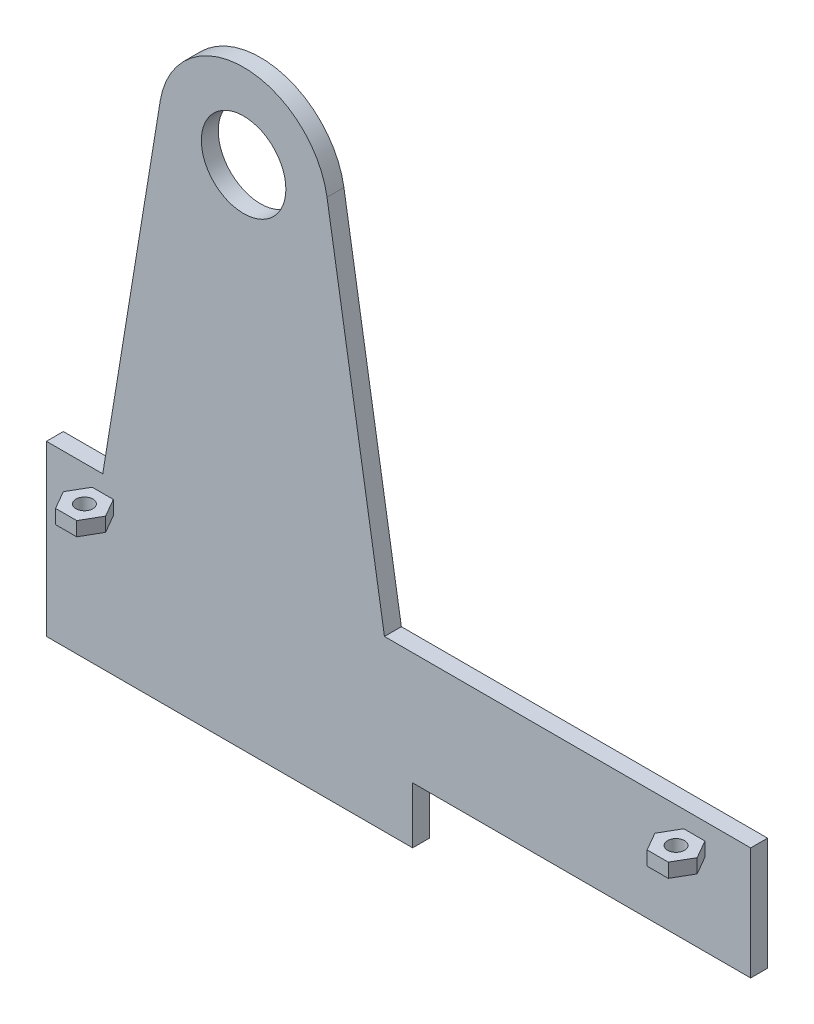
ISO-10303-21;
HEADER;
FILE_DESCRIPTION(('STEP AP214'),'2;1');
FILE_NAME('part.step','',(''),(''),'','','');
FILE_SCHEMA(('AUTOMOTIVE_DESIGN { 1 0 10303 214 1 1 1 1 }'));
ENDSEC;
DATA;
#1=APPLICATION_CONTEXT('core data for automotive mechanical design processes');
#2=APPLICATION_PROTOCOL_DEFINITION('international standard','automotive_design',2000,#1);
#3=PRODUCT_CONTEXT('',#1,'mechanical');
#4=PRODUCT('Part','Part','',(#3));
#5=PRODUCT_RELATED_PRODUCT_CATEGORY('part','',(#4));
#6=PRODUCT_DEFINITION_FORMATION('','',#4);
#7=PRODUCT_DEFINITION_CONTEXT('part definition',#1,'design');
#8=PRODUCT_DEFINITION('design','',#6,#7);
#9=PRODUCT_DEFINITION_SHAPE('','',#8);
#10=(LENGTH_UNIT() NAMED_UNIT(*) SI_UNIT(.MILLI.,.METRE.));
#11=(NAMED_UNIT(*) PLANE_ANGLE_UNIT() SI_UNIT($,.RADIAN.));
#12=(NAMED_UNIT(*) SI_UNIT($,.STERADIAN.) SOLID_ANGLE_UNIT());
#13=UNCERTAINTY_MEASURE_WITH_UNIT(LENGTH_MEASURE(1.E-05),#10,'distance_accuracy_value','');
#14=(GEOMETRIC_REPRESENTATION_CONTEXT(3) GLOBAL_UNCERTAINTY_ASSIGNED_CONTEXT((#13)) GLOBAL_UNIT_ASSIGNED_CONTEXT((#10,
#11,#12)) REPRESENTATION_CONTEXT('',''));
#15=CARTESIAN_POINT('',(0.,0.,0.));
#16=DIRECTION('',(0.,0.,1.));
#17=DIRECTION('',(1.,0.,0.));
#18=AXIS2_PLACEMENT_3D('',#15,#16,#17);
#19=CARTESIAN_POINT('',(-41.2472232502675,49.,19.));
#20=DIRECTION('',(0.866025403784439,0.,0.5));
#21=DIRECTION('',(0.5,0.,-0.866025403784439));
#22=AXIS2_PLACEMENT_3D('',#19,#20,#21);
#23=PLANE('',#22);
#24=DIRECTION('',(0.5,0.,-0.866025403784439));
#25=VECTOR('',#24,1.);
#26=CARTESIAN_POINT('',(-41.2472232502675,54.,19.));
#27=LINE('',#26,#25);
#28=CARTESIAN_POINT('',(-41.2472232502675,54.,19.));
#29=VERTEX_POINT('',#28);
#30=CARTESIAN_POINT('',(-37.4944465005349,54.,12.5));
#31=VERTEX_POINT('',#30);
#32=EDGE_CURVE('E140',#29,#31,#27,.T.);
#33=ORIENTED_EDGE('',*,*,#32,.F.);
#34=DIRECTION('',(0.,1.,0.));
#35=VECTOR('',#34,1.);
#36=CARTESIAN_POINT('',(-41.2472232502675,49.,19.));
#37=LINE('',#36,#35);
#38=CARTESIAN_POINT('',(-41.2472232502675,49.,19.));
#39=VERTEX_POINT('',#38);
#40=EDGE_CURVE('E12',#39,#29,#37,.T.);
#41=ORIENTED_EDGE('',*,*,#40,.F.);
#42=DIRECTION('',(0.5,0.,-0.866025403784439));
#43=VECTOR('',#42,1.);
#44=CARTESIAN_POINT('',(-41.2472232502675,49.,19.));
#45=LINE('',#44,#43);
#46=CARTESIAN_POINT('',(-37.4944465005349,49.,12.5));
#47=VERTEX_POINT('',#46);
#48=EDGE_CURVE('E150',#39,#47,#45,.T.);
#49=ORIENTED_EDGE('',*,*,#48,.T.);
#50=DIRECTION('',(0.,1.,0.));
#51=VECTOR('',#50,1.);
#52=CARTESIAN_POINT('',(-37.4944465005349,49.,12.5));
#53=LINE('',#52,#51);
#54=EDGE_CURVE('E51',#47,#31,#53,.T.);
#55=ORIENTED_EDGE('',*,*,#54,.T.);
#56=EDGE_LOOP('',(#33,#41,#49,#55));
#57=FACE_BOUND('',#56,.T.);
#58=ADVANCED_FACE('F48',(#57),#23,.T.);
#59=CARTESIAN_POINT('',(-48.7527767497326,49.,19.));
#60=DIRECTION('',(0.,0.,1.));
#61=DIRECTION('',(1.,0.,0.));
#62=AXIS2_PLACEMENT_3D('',#59,#60,#61);
#63=PLANE('',#62);
#64=DIRECTION('',(1.,0.,0.));
#65=VECTOR('',#64,1.);
#66=CARTESIAN_POINT('',(-48.7527767497326,54.,19.));
#67=LINE('',#66,#65);
#68=CARTESIAN_POINT('',(-48.7527767497326,54.,19.));
#69=VERTEX_POINT('',#68);
#70=EDGE_CURVE('E93',#69,#29,#67,.T.);
#71=ORIENTED_EDGE('',*,*,#70,.F.);
#72=DIRECTION('',(0.,1.,0.));
#73=VECTOR('',#72,1.);
#74=CARTESIAN_POINT('',(-48.7527767497326,49.,19.));
#75=LINE('',#74,#73);
#76=CARTESIAN_POINT('',(-48.7527767497326,49.,19.));
#77=VERTEX_POINT('',#76);
#78=EDGE_CURVE('E57',#77,#69,#75,.T.);
#79=ORIENTED_EDGE('',*,*,#78,.F.);
#80=DIRECTION('',(1.,0.,0.));
#81=VECTOR('',#80,1.);
#82=CARTESIAN_POINT('',(-48.7527767497326,49.,19.));
#83=LINE('',#82,#81);
#84=EDGE_CURVE('E65',#77,#39,#83,.T.);
#85=ORIENTED_EDGE('',*,*,#84,.T.);
#86=ORIENTED_EDGE('',*,*,#40,.T.);
#87=EDGE_LOOP('',(#71,#79,#85,#86));
#88=FACE_BOUND('',#87,.T.);
#89=ADVANCED_FACE('F171',(#88),#63,.T.);
#90=CARTESIAN_POINT('',(-52.5055534994651,49.,12.5));
#91=DIRECTION('',(-0.866025403784438,0.,0.5));
#92=DIRECTION('',(0.5,0.,0.866025403784439));
#93=AXIS2_PLACEMENT_3D('',#90,#91,#92);
#94=PLANE('',#93);
#95=DIRECTION('',(0.5,0.,0.866025403784438));
#96=VECTOR('',#95,1.);
#97=CARTESIAN_POINT('',(-52.5055534994651,54.,12.5));
#98=LINE('',#97,#96);
#99=CARTESIAN_POINT('',(-52.5055534994651,54.,12.5));
#100=VERTEX_POINT('',#99);
#101=EDGE_CURVE('E88',#100,#69,#98,.T.);
#102=ORIENTED_EDGE('',*,*,#101,.F.);
#103=DIRECTION('',(0.,1.,0.));
#104=VECTOR('',#103,1.);
#105=CARTESIAN_POINT('',(-52.5055534994651,49.,12.5));
#106=LINE('',#105,#104);
#107=CARTESIAN_POINT('',(-52.5055534994651,49.,12.5));
#108=VERTEX_POINT('',#107);
#109=EDGE_CURVE('E116',#108,#100,#106,.T.);
#110=ORIENTED_EDGE('',*,*,#109,.F.);
#111=DIRECTION('',(0.5,0.,0.866025403784438));
#112=VECTOR('',#111,1.);
#113=CARTESIAN_POINT('',(-52.5055534994651,49.,12.5));
#114=LINE('',#113,#112);
#115=EDGE_CURVE('E119',#108,#77,#114,.T.);
#116=ORIENTED_EDGE('',*,*,#115,.T.);
#117=ORIENTED_EDGE('',*,*,#78,.T.);
#118=EDGE_LOOP('',(#102,#110,#116,#117));
#119=FACE_BOUND('',#118,.T.);
#120=ADVANCED_FACE('F125',(#119),#94,.T.);
#121=CARTESIAN_POINT('',(-48.7527767497326,49.,6.));
#122=DIRECTION('',(-0.866025403784439,0.,-0.5));
#123=DIRECTION('',(-0.5,0.,0.866025403784439));
#124=AXIS2_PLACEMENT_3D('',#121,#122,#123);
#125=PLANE('',#124);
#126=DIRECTION('',(-0.5,0.,0.866025403784439));
#127=VECTOR('',#126,1.);
#128=CARTESIAN_POINT('',(-48.7527767497326,54.,6.));
#129=LINE('',#128,#127);
#130=CARTESIAN_POINT('',(-48.7527767497326,54.,6.));
#131=VERTEX_POINT('',#130);
#132=EDGE_CURVE('E147',#131,#100,#129,.T.);
#133=ORIENTED_EDGE('',*,*,#132,.F.);
#134=DIRECTION('',(0.,1.,0.));
#135=VECTOR('',#134,1.);
#136=CARTESIAN_POINT('',(-48.7527767497326,49.,6.));
#137=LINE('',#136,#135);
#138=CARTESIAN_POINT('',(-48.7527767497326,49.,6.));
#139=VERTEX_POINT('',#138);
#140=EDGE_CURVE('E118',#139,#131,#137,.T.);
#141=ORIENTED_EDGE('',*,*,#140,.F.);
#142=DIRECTION('',(-0.5,0.,0.866025403784439));
#143=VECTOR('',#142,1.);
#144=CARTESIAN_POINT('',(-48.7527767497326,49.,6.));
#145=LINE('',#144,#143);
#146=EDGE_CURVE('E111',#139,#108,#145,.T.);
#147=ORIENTED_EDGE('',*,*,#146,.T.);
#148=ORIENTED_EDGE('',*,*,#109,.T.);
#149=EDGE_LOOP('',(#133,#141,#147,#148));
#150=FACE_BOUND('',#149,.T.);
#151=ADVANCED_FACE('F114',(#150),#125,.T.);
#152=CARTESIAN_POINT('',(-41.2472232502674,49.,6.));
#153=DIRECTION('',(0.,0.,-1.));
#154=DIRECTION('',(-1.,0.,0.));
#155=AXIS2_PLACEMENT_3D('',#152,#153,#154);
#156=PLANE('',#155);
#157=DIRECTION('',(-1.,0.,0.));
#158=VECTOR('',#157,1.);
#159=CARTESIAN_POINT('',(-41.2472232502674,54.,6.));
#160=LINE('',#159,#158);
#161=CARTESIAN_POINT('',(-41.2472232502674,54.,6.));
#162=VERTEX_POINT('',#161);
#163=EDGE_CURVE('E145',#162,#131,#160,.T.);
#164=ORIENTED_EDGE('',*,*,#163,.F.);
#165=DIRECTION('',(0.,1.,0.));
#166=VECTOR('',#165,1.);
#167=CARTESIAN_POINT('',(-41.2472232502674,49.,6.));
#168=LINE('',#167,#166);
#169=CARTESIAN_POINT('',(-41.2472232502674,49.,6.));
#170=VERTEX_POINT('',#169);
#171=EDGE_CURVE('E128',#170,#162,#168,.T.);
#172=ORIENTED_EDGE('',*,*,#171,.F.);
#173=DIRECTION('',(-1.,0.,0.));
#174=VECTOR('',#173,1.);
#175=CARTESIAN_POINT('',(-41.2472232502674,49.,6.));
#176=LINE('',#175,#174);
#177=EDGE_CURVE('E120',#170,#139,#176,.T.);
#178=ORIENTED_EDGE('',*,*,#177,.T.);
#179=ORIENTED_EDGE('',*,*,#140,.T.);
#180=EDGE_LOOP('',(#164,#172,#178,#179));
#181=FACE_BOUND('',#180,.T.);
#182=ADVANCED_FACE('F159',(#181),#156,.T.);
#183=CARTESIAN_POINT('',(-37.4944465005349,49.,12.5));
#184=DIRECTION('',(0.86602540378444,0.,-0.499999999999997));
#185=DIRECTION('',(-0.499999999999997,0.,-0.86602540378444));
#186=AXIS2_PLACEMENT_3D('',#183,#184,#185);
#187=PLANE('',#186);
#188=DIRECTION('',(-0.499999999999997,0.,-0.86602540378444));
#189=VECTOR('',#188,1.);
#190=CARTESIAN_POINT('',(-37.4944465005349,54.,12.5));
#191=LINE('',#190,#189);
#192=EDGE_CURVE('E142',#31,#162,#191,.T.);
#193=ORIENTED_EDGE('',*,*,#192,.F.);
#194=ORIENTED_EDGE('',*,*,#54,.F.);
#195=DIRECTION('',(-0.499999999999997,0.,-0.86602540378444));
#196=VECTOR('',#195,1.);
#197=CARTESIAN_POINT('',(-37.4944465005349,49.,12.5));
#198=LINE('',#197,#196);
#199=EDGE_CURVE('E100',#47,#170,#198,.T.);
#200=ORIENTED_EDGE('',*,*,#199,.T.);
#201=ORIENTED_EDGE('',*,*,#171,.T.);
#202=EDGE_LOOP('',(#193,#194,#200,#201));
#203=FACE_BOUND('',#202,.T.);
#204=ADVANCED_FACE('F161',(#203),#187,.T.);
#205=CARTESIAN_POINT('',(120.,49.,0.));
#206=DIRECTION('',(0.,1.,0.));
#207=DIRECTION('',(0.,0.,-1.));
#208=AXIS2_PLACEMENT_3D('',#205,#206,#207);
#209=PLANE('',#208);
#210=CARTESIAN_POINT('',(-45.,49.,12.5));
#211=DIRECTION('',(0.,1.,0.));
#212=DIRECTION('',(0.,0.,-1.));
#213=AXIS2_PLACEMENT_3D('',#210,#211,#212);
#214=CIRCLE('',#213,2.99999999999999);
#215=CARTESIAN_POINT('',(-45.,49.,9.50000000000003));
#216=VERTEX_POINT('',#215);
#217=EDGE_CURVE('E143',#216,#216,#214,.T.);
#218=ORIENTED_EDGE('',*,*,#217,.T.);
#219=EDGE_LOOP('',(#218));
#220=FACE_BOUND('',#219,.T.);
#221=ORIENTED_EDGE('',*,*,#48,.F.);
#222=ORIENTED_EDGE('',*,*,#84,.F.);
#223=ORIENTED_EDGE('',*,*,#115,.F.);
#224=ORIENTED_EDGE('',*,*,#146,.F.);
#225=ORIENTED_EDGE('',*,*,#177,.F.);
#226=ORIENTED_EDGE('',*,*,#199,.F.);
#227=EDGE_LOOP('',(#221,#222,#223,#224,#225,#226));
#228=FACE_BOUND('',#227,.T.);
#229=ADVANCED_FACE('F122',(#220,#228),#209,.F.);
#230=CARTESIAN_POINT('',(120.,54.,0.));
#231=DIRECTION('',(0.,1.,0.));
#232=DIRECTION('',(0.,0.,-1.));
#233=AXIS2_PLACEMENT_3D('',#230,#231,#232);
#234=PLANE('',#233);
#235=CARTESIAN_POINT('',(-45.,54.,12.5));
#236=DIRECTION('',(0.,1.,0.));
#237=DIRECTION('',(0.,0.,-1.));
#238=AXIS2_PLACEMENT_3D('',#235,#236,#237);
#239=CIRCLE('',#238,2.99999999999999);
#240=CARTESIAN_POINT('',(-45.,54.,9.50000000000003));
#241=VERTEX_POINT('',#240);
#242=EDGE_CURVE('E155',#241,#241,#239,.T.);
#243=ORIENTED_EDGE('',*,*,#242,.F.);
#244=EDGE_LOOP('',(#243));
#245=FACE_BOUND('',#244,.T.);
#246=ORIENTED_EDGE('',*,*,#32,.T.);
#247=ORIENTED_EDGE('',*,*,#192,.T.);
#248=ORIENTED_EDGE('',*,*,#163,.T.);
#249=ORIENTED_EDGE('',*,*,#132,.T.);
#250=ORIENTED_EDGE('',*,*,#101,.T.);
#251=ORIENTED_EDGE('',*,*,#70,.T.);
#252=EDGE_LOOP('',(#246,#247,#248,#249,#250,#251));
#253=FACE_BOUND('',#252,.T.);
#254=ADVANCED_FACE('F160',(#245,#253),#234,.T.);
#255=CARTESIAN_POINT('',(-45.,49.,12.5));
#256=DIRECTION('',(0.,1.,0.));
#257=DIRECTION('',(0.,0.,-1.));
#258=AXIS2_PLACEMENT_3D('',#255,#256,#257);
#259=CYLINDRICAL_SURFACE('',#258,2.99999999999999);
#260=ORIENTED_EDGE('',*,*,#217,.F.);
#261=EDGE_LOOP('',(#260));
#262=FACE_BOUND('',#261,.T.);
#263=ORIENTED_EDGE('',*,*,#242,.T.);
#264=EDGE_LOOP('',(#263));
#265=FACE_BOUND('',#264,.T.);
#266=ADVANCED_FACE('F210',(#262,#265),#259,.F.);
#267=CLOSED_SHELL('',(#58,#89,#120,#151,#182,#204,#229,#254,#266));
#268=MANIFOLD_SOLID_BREP('B2',#267);
#269=CARTESIAN_POINT('',(161.247223250267,49.,19.));
#270=DIRECTION('',(-0.866025403784439,0.,0.5));
#271=DIRECTION('',(-0.5,0.,-0.866025403784439));
#272=AXIS2_PLACEMENT_3D('',#269,#270,#271);
#273=PLANE('',#272);
#274=DIRECTION('',(-0.5,0.,-0.866025403784439));
#275=VECTOR('',#274,1.);
#276=CARTESIAN_POINT('',(161.247223250267,54.,19.));
#277=LINE('',#276,#275);
#278=CARTESIAN_POINT('',(161.247223250267,54.,19.));
#279=VERTEX_POINT('',#278);
#280=CARTESIAN_POINT('',(157.494446500535,54.,12.5));
#281=VERTEX_POINT('',#280);
#282=EDGE_CURVE('E338',#279,#281,#277,.T.);
#283=ORIENTED_EDGE('',*,*,#282,.T.);
#284=DIRECTION('',(0.,1.,0.));
#285=VECTOR('',#284,1.);
#286=CARTESIAN_POINT('',(157.494446500535,49.,12.5));
#287=LINE('',#286,#285);
#288=CARTESIAN_POINT('',(157.494446500535,49.,12.5));
#289=VERTEX_POINT('',#288);
#290=EDGE_CURVE('E257',#289,#281,#287,.T.);
#291=ORIENTED_EDGE('',*,*,#290,.F.);
#292=DIRECTION('',(-0.5,0.,-0.866025403784439));
#293=VECTOR('',#292,1.);
#294=CARTESIAN_POINT('',(161.247223250267,49.,19.));
#295=LINE('',#294,#293);
#296=CARTESIAN_POINT('',(161.247223250267,49.,19.));
#297=VERTEX_POINT('',#296);
#298=EDGE_CURVE('E348',#297,#289,#295,.T.);
#299=ORIENTED_EDGE('',*,*,#298,.F.);
#300=DIRECTION('',(0.,1.,0.));
#301=VECTOR('',#300,1.);
#302=CARTESIAN_POINT('',(161.247223250267,49.,19.));
#303=LINE('',#302,#301);
#304=EDGE_CURVE('E46',#297,#279,#303,.T.);
#305=ORIENTED_EDGE('',*,*,#304,.T.);
#306=EDGE_LOOP('',(#283,#291,#299,#305));
#307=FACE_BOUND('',#306,.T.);
#308=ADVANCED_FACE('F254',(#307),#273,.T.);
#309=CARTESIAN_POINT('',(168.752776749733,49.,19.));
#310=DIRECTION('',(0.,0.,1.));
#311=DIRECTION('',(-1.,0.,0.));
#312=AXIS2_PLACEMENT_3D('',#309,#310,#311);
#313=PLANE('',#312);
#314=DIRECTION('',(-1.,0.,0.));
#315=VECTOR('',#314,1.);
#316=CARTESIAN_POINT('',(168.752776749733,54.,19.));
#317=LINE('',#316,#315);
#318=CARTESIAN_POINT('',(168.752776749733,54.,19.));
#319=VERTEX_POINT('',#318);
#320=EDGE_CURVE('E301',#319,#279,#317,.T.);
#321=ORIENTED_EDGE('',*,*,#320,.T.);
#322=ORIENTED_EDGE('',*,*,#304,.F.);
#323=DIRECTION('',(-1.,0.,0.));
#324=VECTOR('',#323,1.);
#325=CARTESIAN_POINT('',(168.752776749733,49.,19.));
#326=LINE('',#325,#324);
#327=CARTESIAN_POINT('',(168.752776749733,49.,19.));
#328=VERTEX_POINT('',#327);
#329=EDGE_CURVE('E272',#328,#297,#326,.T.);
#330=ORIENTED_EDGE('',*,*,#329,.F.);
#331=DIRECTION('',(0.,1.,0.));
#332=VECTOR('',#331,1.);
#333=CARTESIAN_POINT('',(168.752776749733,49.,19.));
#334=LINE('',#333,#332);
#335=EDGE_CURVE('E263',#328,#319,#334,.T.);
#336=ORIENTED_EDGE('',*,*,#335,.T.);
#337=EDGE_LOOP('',(#321,#322,#330,#336));
#338=FACE_BOUND('',#337,.T.);
#339=ADVANCED_FACE('F385',(#338),#313,.T.);
#340=CARTESIAN_POINT('',(172.505553499465,49.,12.5));
#341=DIRECTION('',(0.866025403784438,0.,0.5));
#342=DIRECTION('',(-0.5,0.,0.866025403784439));
#343=AXIS2_PLACEMENT_3D('',#340,#341,#342);
#344=PLANE('',#343);
#345=DIRECTION('',(-0.5,0.,0.866025403784438));
#346=VECTOR('',#345,1.);
#347=CARTESIAN_POINT('',(172.505553499465,54.,12.5));
#348=LINE('',#347,#346);
#349=CARTESIAN_POINT('',(172.505553499465,54.,12.5));
#350=VERTEX_POINT('',#349);
#351=EDGE_CURVE('E295',#350,#319,#348,.T.);
#352=ORIENTED_EDGE('',*,*,#351,.T.);
#353=ORIENTED_EDGE('',*,*,#335,.F.);
#354=DIRECTION('',(-0.5,0.,0.866025403784438));
#355=VECTOR('',#354,1.);
#356=CARTESIAN_POINT('',(172.505553499465,49.,12.5));
#357=LINE('',#356,#355);
#358=CARTESIAN_POINT('',(172.505553499465,49.,12.5));
#359=VERTEX_POINT('',#358);
#360=EDGE_CURVE('E320',#359,#328,#357,.T.);
#361=ORIENTED_EDGE('',*,*,#360,.F.);
#362=DIRECTION('',(0.,1.,0.));
#363=VECTOR('',#362,1.);
#364=CARTESIAN_POINT('',(172.505553499465,49.,12.5));
#365=LINE('',#364,#363);
#366=EDGE_CURVE('E327',#359,#350,#365,.T.);
#367=ORIENTED_EDGE('',*,*,#366,.T.);
#368=EDGE_LOOP('',(#352,#353,#361,#367));
#369=FACE_BOUND('',#368,.T.);
#370=ADVANCED_FACE('F333',(#369),#344,.T.);
#371=CARTESIAN_POINT('',(168.752776749733,49.,6.));
#372=DIRECTION('',(0.866025403784439,0.,-0.5));
#373=DIRECTION('',(0.5,0.,0.866025403784439));
#374=AXIS2_PLACEMENT_3D('',#371,#372,#373);
#375=PLANE('',#374);
#376=DIRECTION('',(0.5,0.,0.866025403784439));
#377=VECTOR('',#376,1.);
#378=CARTESIAN_POINT('',(168.752776749733,54.,6.));
#379=LINE('',#378,#377);
#380=CARTESIAN_POINT('',(168.752776749733,54.,6.));
#381=VERTEX_POINT('',#380);
#382=EDGE_CURVE('E330',#381,#350,#379,.T.);
#383=ORIENTED_EDGE('',*,*,#382,.T.);
#384=ORIENTED_EDGE('',*,*,#366,.F.);
#385=DIRECTION('',(0.5,0.,0.866025403784439));
#386=VECTOR('',#385,1.);
#387=CARTESIAN_POINT('',(168.752776749733,49.,6.));
#388=LINE('',#387,#386);
#389=CARTESIAN_POINT('',(168.752776749733,49.,6.));
#390=VERTEX_POINT('',#389);
#391=EDGE_CURVE('E316',#390,#359,#388,.T.);
#392=ORIENTED_EDGE('',*,*,#391,.F.);
#393=DIRECTION('',(0.,1.,0.));
#394=VECTOR('',#393,1.);
#395=CARTESIAN_POINT('',(168.752776749733,49.,6.));
#396=LINE('',#395,#394);
#397=EDGE_CURVE('E331',#390,#381,#396,.T.);
#398=ORIENTED_EDGE('',*,*,#397,.T.);
#399=EDGE_LOOP('',(#383,#384,#392,#398));
#400=FACE_BOUND('',#399,.T.);
#401=ADVANCED_FACE('F328',(#400),#375,.T.);
#402=CARTESIAN_POINT('',(161.247223250267,49.,6.));
#403=DIRECTION('',(0.,0.,-1.));
#404=DIRECTION('',(1.,0.,0.));
#405=AXIS2_PLACEMENT_3D('',#402,#403,#404);
#406=PLANE('',#405);
#407=DIRECTION('',(1.,0.,0.));
#408=VECTOR('',#407,1.);
#409=CARTESIAN_POINT('',(161.247223250267,54.,6.));
#410=LINE('',#409,#408);
#411=CARTESIAN_POINT('',(161.247223250267,54.,6.));
#412=VERTEX_POINT('',#411);
#413=EDGE_CURVE('E344',#412,#381,#410,.T.);
#414=ORIENTED_EDGE('',*,*,#413,.T.);
#415=ORIENTED_EDGE('',*,*,#397,.F.);
#416=DIRECTION('',(1.,0.,0.));
#417=VECTOR('',#416,1.);
#418=CARTESIAN_POINT('',(161.247223250267,49.,6.));
#419=LINE('',#418,#417);
#420=CARTESIAN_POINT('',(161.247223250267,49.,6.));
#421=VERTEX_POINT('',#420);
#422=EDGE_CURVE('E322',#421,#390,#419,.T.);
#423=ORIENTED_EDGE('',*,*,#422,.F.);
#424=DIRECTION('',(0.,1.,0.));
#425=VECTOR('',#424,1.);
#426=CARTESIAN_POINT('',(161.247223250267,49.,6.));
#427=LINE('',#426,#425);
#428=EDGE_CURVE('E351',#421,#412,#427,.T.);
#429=ORIENTED_EDGE('',*,*,#428,.T.);
#430=EDGE_LOOP('',(#414,#415,#423,#429));
#431=FACE_BOUND('',#430,.T.);
#432=ADVANCED_FACE('F362',(#431),#406,.T.);
#433=CARTESIAN_POINT('',(157.494446500535,49.,12.5));
#434=DIRECTION('',(-0.86602540378444,0.,-0.499999999999997));
#435=DIRECTION('',(0.499999999999997,0.,-0.86602540378444));
#436=AXIS2_PLACEMENT_3D('',#433,#434,#435);
#437=PLANE('',#436);
#438=DIRECTION('',(0.499999999999997,0.,-0.86602540378444));
#439=VECTOR('',#438,1.);
#440=CARTESIAN_POINT('',(157.494446500535,54.,12.5));
#441=LINE('',#440,#439);
#442=EDGE_CURVE('E341',#281,#412,#441,.T.);
#443=ORIENTED_EDGE('',*,*,#442,.T.);
#444=ORIENTED_EDGE('',*,*,#428,.F.);
#445=DIRECTION('',(0.499999999999997,0.,-0.86602540378444));
#446=VECTOR('',#445,1.);
#447=CARTESIAN_POINT('',(157.494446500535,49.,12.5));
#448=LINE('',#447,#446);
#449=EDGE_CURVE('E309',#289,#421,#448,.T.);
#450=ORIENTED_EDGE('',*,*,#449,.F.);
#451=ORIENTED_EDGE('',*,*,#290,.T.);
#452=EDGE_LOOP('',(#443,#444,#450,#451));
#453=FACE_BOUND('',#452,.T.);
#454=ADVANCED_FACE('F356',(#453),#437,.T.);
#455=CARTESIAN_POINT('',(0.,49.,0.));
#456=DIRECTION('',(0.,1.,0.));
#457=DIRECTION('',(0.,0.,-1.));
#458=AXIS2_PLACEMENT_3D('',#455,#456,#457);
#459=PLANE('',#458);
#460=CARTESIAN_POINT('',(165.,49.,12.5));
#461=DIRECTION('',(0.,-1.,0.));
#462=DIRECTION('',(0.,0.,-1.));
#463=AXIS2_PLACEMENT_3D('',#460,#461,#462);
#464=CIRCLE('',#463,2.99999999999999);
#465=CARTESIAN_POINT('',(165.,49.,9.50000000000003));
#466=VERTEX_POINT('',#465);
#467=EDGE_CURVE('E342',#466,#466,#464,.T.);
#468=ORIENTED_EDGE('',*,*,#467,.F.);
#469=EDGE_LOOP('',(#468));
#470=FACE_BOUND('',#469,.T.);
#471=ORIENTED_EDGE('',*,*,#298,.T.);
#472=ORIENTED_EDGE('',*,*,#449,.T.);
#473=ORIENTED_EDGE('',*,*,#422,.T.);
#474=ORIENTED_EDGE('',*,*,#391,.T.);
#475=ORIENTED_EDGE('',*,*,#360,.T.);
#476=ORIENTED_EDGE('',*,*,#329,.T.);
#477=EDGE_LOOP('',(#471,#472,#473,#474,#475,#476));
#478=FACE_BOUND('',#477,.T.);
#479=ADVANCED_FACE('F318',(#470,#478),#459,.F.);
#480=CARTESIAN_POINT('',(0.,54.,0.));
#481=DIRECTION('',(0.,1.,0.));
#482=DIRECTION('',(0.,0.,-1.));
#483=AXIS2_PLACEMENT_3D('',#480,#481,#482);
#484=PLANE('',#483);
#485=CARTESIAN_POINT('',(165.,54.,12.5));
#486=DIRECTION('',(0.,-1.,0.));
#487=DIRECTION('',(0.,0.,-1.));
#488=AXIS2_PLACEMENT_3D('',#485,#486,#487);
#489=CIRCLE('',#488,2.99999999999999);
#490=CARTESIAN_POINT('',(165.,54.,9.50000000000003));
#491=VERTEX_POINT('',#490);
#492=EDGE_CURVE('E366',#491,#491,#489,.T.);
#493=ORIENTED_EDGE('',*,*,#492,.T.);
#494=EDGE_LOOP('',(#493));
#495=FACE_BOUND('',#494,.T.);
#496=ORIENTED_EDGE('',*,*,#282,.F.);
#497=ORIENTED_EDGE('',*,*,#320,.F.);
#498=ORIENTED_EDGE('',*,*,#351,.F.);
#499=ORIENTED_EDGE('',*,*,#382,.F.);
#500=ORIENTED_EDGE('',*,*,#413,.F.);
#501=ORIENTED_EDGE('',*,*,#442,.F.);
#502=EDGE_LOOP('',(#496,#497,#498,#499,#500,#501));
#503=FACE_BOUND('',#502,.T.);
#504=ADVANCED_FACE('F361',(#495,#503),#484,.T.);
#505=CARTESIAN_POINT('',(165.,49.,12.5));
#506=DIRECTION('',(0.,1.,0.));
#507=DIRECTION('',(0.,0.,-1.));
#508=AXIS2_PLACEMENT_3D('',#505,#506,#507);
#509=CYLINDRICAL_SURFACE('',#508,2.99999999999999);
#510=ORIENTED_EDGE('',*,*,#467,.T.);
#511=EDGE_LOOP('',(#510));
#512=FACE_BOUND('',#511,.T.);
#513=ORIENTED_EDGE('',*,*,#492,.F.);
#514=EDGE_LOOP('',(#513));
#515=FACE_BOUND('',#514,.T.);
#516=ADVANCED_FACE('F372',(#512,#515),#509,.F.);
#517=CLOSED_SHELL('',(#308,#339,#370,#401,#432,#454,#479,#504,#516));
#518=MANIFOLD_SOLID_BREP('B6',#517);
#519=CARTESIAN_POINT('',(-65.,60.,6.));
#520=DIRECTION('',(0.,1.,0.));
#521=DIRECTION('',(0.,0.,-1.));
#522=AXIS2_PLACEMENT_3D('',#519,#520,#521);
#523=PLANE('',#522);
#524=DIRECTION('',(-1.,0.,0.));
#525=VECTOR('',#524,1.);
#526=CARTESIAN_POINT('',(-65.,60.,6.));
#527=LINE('',#526,#525);
#528=CARTESIAN_POINT('',(185.,60.,6.));
#529=VERTEX_POINT('',#528);
#530=CARTESIAN_POINT('',(55.,60.,6.));
#531=VERTEX_POINT('',#530);
#532=EDGE_CURVE('E530',#529,#531,#527,.T.);
#533=ORIENTED_EDGE('',*,*,#532,.F.);
#534=DIRECTION('',(0.,0.,-1.));
#535=VECTOR('',#534,1.);
#536=CARTESIAN_POINT('',(185.,60.,6.));
#537=LINE('',#536,#535);
#538=CARTESIAN_POINT('',(185.,60.,0.));
#539=VERTEX_POINT('',#538);
#540=EDGE_CURVE('E539',#529,#539,#537,.T.);
#541=ORIENTED_EDGE('',*,*,#540,.T.);
#542=DIRECTION('',(-1.,0.,0.));
#543=VECTOR('',#542,1.);
#544=CARTESIAN_POINT('',(-65.,60.,0.));
#545=LINE('',#544,#543);
#546=CARTESIAN_POINT('',(55.,60.,0.));
#547=VERTEX_POINT('',#546);
#548=EDGE_CURVE('E563',#539,#547,#545,.T.);
#549=ORIENTED_EDGE('',*,*,#548,.T.);
#550=DIRECTION('',(0.,0.,-1.));
#551=VECTOR('',#550,1.);
#552=CARTESIAN_POINT('',(55.,60.,6.));
#553=LINE('',#552,#551);
#554=EDGE_CURVE('E548',#531,#547,#553,.T.);
#555=ORIENTED_EDGE('',*,*,#554,.F.);
#556=EDGE_LOOP('',(#533,#541,#549,#555));
#557=FACE_BOUND('',#556,.T.);
#558=ADVANCED_FACE('F451',(#557),#523,.T.);
#559=CARTESIAN_POINT('',(65.,0.,6.));
#560=DIRECTION('',(0.,-1.,0.));
#561=DIRECTION('',(0.,0.,1.));
#562=AXIS2_PLACEMENT_3D('',#559,#560,#561);
#563=PLANE('',#562);
#564=DIRECTION('',(1.,0.,0.));
#565=VECTOR('',#564,1.);
#566=CARTESIAN_POINT('',(65.,0.,0.));
#567=LINE('',#566,#565);
#568=CARTESIAN_POINT('',(-65.,0.,0.));
#569=VERTEX_POINT('',#568);
#570=CARTESIAN_POINT('',(65.,0.,0.));
#571=VERTEX_POINT('',#570);
#572=EDGE_CURVE('E553',#569,#571,#567,.T.);
#573=ORIENTED_EDGE('',*,*,#572,.T.);
#574=DIRECTION('',(0.,0.,-1.));
#575=VECTOR('',#574,1.);
#576=CARTESIAN_POINT('',(65.,0.,6.));
#577=LINE('',#576,#575);
#578=CARTESIAN_POINT('',(65.,0.,6.));
#579=VERTEX_POINT('',#578);
#580=EDGE_CURVE('E455',#579,#571,#577,.T.);
#581=ORIENTED_EDGE('',*,*,#580,.F.);
#582=DIRECTION('',(1.,0.,0.));
#583=VECTOR('',#582,1.);
#584=CARTESIAN_POINT('',(65.,0.,6.));
#585=LINE('',#584,#583);
#586=CARTESIAN_POINT('',(-65.,0.,6.));
#587=VERTEX_POINT('',#586);
#588=EDGE_CURVE('E565',#587,#579,#585,.T.);
#589=ORIENTED_EDGE('',*,*,#588,.F.);
#590=DIRECTION('',(0.,0.,-1.));
#591=VECTOR('',#590,1.);
#592=CARTESIAN_POINT('',(-65.,0.,6.));
#593=LINE('',#592,#591);
#594=EDGE_CURVE('E252',#587,#569,#593,.T.);
#595=ORIENTED_EDGE('',*,*,#594,.T.);
#596=EDGE_LOOP('',(#573,#581,#589,#595));
#597=FACE_BOUND('',#596,.T.);
#598=ADVANCED_FACE('F453',(#597),#563,.T.);
#599=CARTESIAN_POINT('',(-65.,0.,6.));
#600=DIRECTION('',(-1.,0.,0.));
#601=DIRECTION('',(0.,0.,-1.));
#602=AXIS2_PLACEMENT_3D('',#599,#600,#601);
#603=PLANE('',#602);
#604=DIRECTION('',(0.,-1.,0.));
#605=VECTOR('',#604,1.);
#606=CARTESIAN_POINT('',(-65.,0.,0.));
#607=LINE('',#606,#605);
#608=CARTESIAN_POINT('',(-65.,60.,0.));
#609=VERTEX_POINT('',#608);
#610=EDGE_CURVE('E504',#609,#569,#607,.T.);
#611=ORIENTED_EDGE('',*,*,#610,.T.);
#612=ORIENTED_EDGE('',*,*,#594,.F.);
#613=DIRECTION('',(0.,-1.,0.));
#614=VECTOR('',#613,1.);
#615=CARTESIAN_POINT('',(-65.,0.,6.));
#616=LINE('',#615,#614);
#617=CARTESIAN_POINT('',(-65.,60.,6.));
#618=VERTEX_POINT('',#617);
#619=EDGE_CURVE('E477',#618,#587,#616,.T.);
#620=ORIENTED_EDGE('',*,*,#619,.F.);
#621=DIRECTION('',(0.,0.,-1.));
#622=VECTOR('',#621,1.);
#623=CARTESIAN_POINT('',(-65.,60.,6.));
#624=LINE('',#623,#622);
#625=EDGE_CURVE('E460',#618,#609,#624,.T.);
#626=ORIENTED_EDGE('',*,*,#625,.T.);
#627=EDGE_LOOP('',(#611,#612,#620,#626));
#628=FACE_BOUND('',#627,.T.);
#629=ADVANCED_FACE('F632',(#628),#603,.T.);
#630=DIRECTION('',(0.,0.,-1.));
#631=VECTOR('',#630,1.);
#632=CARTESIAN_POINT('',(-45.,60.,6.));
#633=LINE('',#632,#631);
#634=CARTESIAN_POINT('',(-45.,60.,6.));
#635=VERTEX_POINT('',#634);
#636=CARTESIAN_POINT('',(-45.,60.,0.));
#637=VERTEX_POINT('',#636);
#638=EDGE_CURVE('E557',#635,#637,#633,.T.);
#639=ORIENTED_EDGE('',*,*,#638,.T.);
#640=EDGE_CURVE('E562',#637,#609,#545,.T.);
#641=ORIENTED_EDGE('',*,*,#640,.T.);
#642=ORIENTED_EDGE('',*,*,#625,.F.);
#643=EDGE_CURVE('E536',#635,#618,#527,.T.);
#644=ORIENTED_EDGE('',*,*,#643,.F.);
#645=EDGE_LOOP('',(#639,#641,#642,#644));
#646=FACE_BOUND('',#645,.T.);
#647=ADVANCED_FACE('F628',(#646),#523,.T.);
#648=CARTESIAN_POINT('',(185.,60.,6.));
#649=DIRECTION('',(1.,0.,0.));
#650=DIRECTION('',(0.,0.,1.));
#651=AXIS2_PLACEMENT_3D('',#648,#649,#650);
#652=PLANE('',#651);
#653=DIRECTION('',(0.,1.,0.));
#654=VECTOR('',#653,1.);
#655=CARTESIAN_POINT('',(185.,60.,0.));
#656=LINE('',#655,#654);
#657=CARTESIAN_POINT('',(185.,20.,0.));
#658=VERTEX_POINT('',#657);
#659=EDGE_CURVE('E542',#658,#539,#656,.T.);
#660=ORIENTED_EDGE('',*,*,#659,.T.);
#661=ORIENTED_EDGE('',*,*,#540,.F.);
#662=DIRECTION('',(0.,1.,0.));
#663=VECTOR('',#662,1.);
#664=CARTESIAN_POINT('',(185.,60.,6.));
#665=LINE('',#664,#663);
#666=CARTESIAN_POINT('',(185.,20.,6.));
#667=VERTEX_POINT('',#666);
#668=EDGE_CURVE('E523',#667,#529,#665,.T.);
#669=ORIENTED_EDGE('',*,*,#668,.F.);
#670=DIRECTION('',(0.,0.,-1.));
#671=VECTOR('',#670,1.);
#672=CARTESIAN_POINT('',(185.,20.,6.));
#673=LINE('',#672,#671);
#674=EDGE_CURVE('E545',#667,#658,#673,.T.);
#675=ORIENTED_EDGE('',*,*,#674,.T.);
#676=EDGE_LOOP('',(#660,#661,#669,#675));
#677=FACE_BOUND('',#676,.T.);
#678=ADVANCED_FACE('F540',(#677),#652,.T.);
#679=CARTESIAN_POINT('',(185.,20.,6.));
#680=DIRECTION('',(0.,-1.,0.));
#681=DIRECTION('',(1.,0.,0.));
#682=AXIS2_PLACEMENT_3D('',#679,#680,#681);
#683=PLANE('',#682);
#684=DIRECTION('',(1.,0.,0.));
#685=VECTOR('',#684,1.);
#686=CARTESIAN_POINT('',(185.,20.,0.));
#687=LINE('',#686,#685);
#688=CARTESIAN_POINT('',(65.,20.,0.));
#689=VERTEX_POINT('',#688);
#690=EDGE_CURVE('E559',#689,#658,#687,.T.);
#691=ORIENTED_EDGE('',*,*,#690,.T.);
#692=ORIENTED_EDGE('',*,*,#674,.F.);
#693=DIRECTION('',(1.,0.,0.));
#694=VECTOR('',#693,1.);
#695=CARTESIAN_POINT('',(185.,20.,6.));
#696=LINE('',#695,#694);
#697=CARTESIAN_POINT('',(65.,20.,6.));
#698=VERTEX_POINT('',#697);
#699=EDGE_CURVE('E532',#698,#667,#696,.T.);
#700=ORIENTED_EDGE('',*,*,#699,.F.);
#701=DIRECTION('',(0.,0.,-1.));
#702=VECTOR('',#701,1.);
#703=CARTESIAN_POINT('',(65.,20.,6.));
#704=LINE('',#703,#702);
#705=EDGE_CURVE('E568',#698,#689,#704,.T.);
#706=ORIENTED_EDGE('',*,*,#705,.T.);
#707=EDGE_LOOP('',(#691,#692,#700,#706));
#708=FACE_BOUND('',#707,.T.);
#709=ADVANCED_FACE('F580',(#708),#683,.T.);
#710=CARTESIAN_POINT('',(65.,20.,6.));
#711=DIRECTION('',(1.,0.,0.));
#712=DIRECTION('',(0.,0.,1.));
#713=AXIS2_PLACEMENT_3D('',#710,#711,#712);
#714=PLANE('',#713);
#715=DIRECTION('',(0.,1.,0.));
#716=VECTOR('',#715,1.);
#717=CARTESIAN_POINT('',(65.,20.,0.));
#718=LINE('',#717,#716);
#719=EDGE_CURVE('E556',#571,#689,#718,.T.);
#720=ORIENTED_EDGE('',*,*,#719,.T.);
#721=ORIENTED_EDGE('',*,*,#705,.F.);
#722=DIRECTION('',(0.,1.,0.));
#723=VECTOR('',#722,1.);
#724=CARTESIAN_POINT('',(65.,20.,6.));
#725=LINE('',#724,#723);
#726=EDGE_CURVE('E512',#579,#698,#725,.T.);
#727=ORIENTED_EDGE('',*,*,#726,.F.);
#728=ORIENTED_EDGE('',*,*,#580,.T.);
#729=EDGE_LOOP('',(#720,#721,#727,#728));
#730=FACE_BOUND('',#729,.T.);
#731=ADVANCED_FACE('F573',(#730),#714,.T.);
#732=CARTESIAN_POINT('',(0.,0.,6.));
#733=DIRECTION('',(0.,0.,1.));
#734=DIRECTION('',(-1.,0.,0.));
#735=AXIS2_PLACEMENT_3D('',#732,#733,#734);
#736=PLANE('',#735);
#737=ORIENTED_EDGE('',*,*,#588,.T.);
#738=ORIENTED_EDGE('',*,*,#726,.T.);
#739=ORIENTED_EDGE('',*,*,#699,.T.);
#740=ORIENTED_EDGE('',*,*,#668,.T.);
#741=ORIENTED_EDGE('',*,*,#532,.T.);
#742=DIRECTION('',(-0.161216291144187,0.986919098746049,0.));
#743=VECTOR('',#742,1.);
#744=CARTESIAN_POINT('',(34.6075729623815,184.836488734326,6.));
#745=LINE('',#744,#743);
#746=CARTESIAN_POINT('',(34.6075729623815,184.836488734326,6.));
#747=VERTEX_POINT('',#746);
#748=EDGE_CURVE('E597',#531,#747,#745,.T.);
#749=ORIENTED_EDGE('',*,*,#748,.T.);
#750=CARTESIAN_POINT('',(5.,180.,6.));
#751=DIRECTION('',(0.,0.,1.));
#752=DIRECTION('',(-1.,0.,0.));
#753=AXIS2_PLACEMENT_3D('',#750,#751,#752);
#754=CIRCLE('',#753,30.);
#755=CARTESIAN_POINT('',(-24.6075729623814,184.836488734326,6.));
#756=VERTEX_POINT('',#755);
#757=EDGE_CURVE('E605',#747,#756,#754,.T.);
#758=ORIENTED_EDGE('',*,*,#757,.T.);
#759=DIRECTION('',(-0.161216291144187,-0.986919098746049,0.));
#760=VECTOR('',#759,1.);
#761=CARTESIAN_POINT('',(-45.,60.,6.));
#762=LINE('',#761,#760);
#763=EDGE_CURVE('E586',#756,#635,#762,.T.);
#764=ORIENTED_EDGE('',*,*,#763,.T.);
#765=ORIENTED_EDGE('',*,*,#643,.T.);
#766=ORIENTED_EDGE('',*,*,#619,.T.);
#767=EDGE_LOOP('',(#737,#738,#739,#740,#741,#749,#758,#764,#765,#766));
#768=FACE_BOUND('',#767,.T.);
#769=CARTESIAN_POINT('',(5.,180.,6.));
#770=DIRECTION('',(0.,0.,1.));
#771=DIRECTION('',(1.,0.,0.));
#772=AXIS2_PLACEMENT_3D('',#769,#770,#771);
#773=CIRCLE('',#772,15.);
#774=CARTESIAN_POINT('',(20.,180.,6.));
#775=VERTEX_POINT('',#774);
#776=EDGE_CURVE('E602',#775,#775,#773,.T.);
#777=ORIENTED_EDGE('',*,*,#776,.F.);
#778=EDGE_LOOP('',(#777));
#779=FACE_BOUND('',#778,.T.);
#780=ADVANCED_FACE('F525',(#768,#779),#736,.T.);
#781=CARTESIAN_POINT('',(0.,0.,0.));
#782=DIRECTION('',(0.,0.,1.));
#783=DIRECTION('',(-1.,0.,0.));
#784=AXIS2_PLACEMENT_3D('',#781,#782,#783);
#785=PLANE('',#784);
#786=ORIENTED_EDGE('',*,*,#572,.F.);
#787=ORIENTED_EDGE('',*,*,#610,.F.);
#788=ORIENTED_EDGE('',*,*,#640,.F.);
#789=DIRECTION('',(-0.161216291144187,-0.986919098746049,0.));
#790=VECTOR('',#789,1.);
#791=CARTESIAN_POINT('',(-45.,60.,0.));
#792=LINE('',#791,#790);
#793=CARTESIAN_POINT('',(-24.6075729623814,184.836488734326,0.));
#794=VERTEX_POINT('',#793);
#795=EDGE_CURVE('E594',#794,#637,#792,.T.);
#796=ORIENTED_EDGE('',*,*,#795,.F.);
#797=CARTESIAN_POINT('',(5.,180.,0.));
#798=DIRECTION('',(0.,0.,1.));
#799=DIRECTION('',(-1.,0.,0.));
#800=AXIS2_PLACEMENT_3D('',#797,#798,#799);
#801=CIRCLE('',#800,30.);
#802=CARTESIAN_POINT('',(34.6075729623815,184.836488734326,0.));
#803=VERTEX_POINT('',#802);
#804=EDGE_CURVE('E598',#803,#794,#801,.T.);
#805=ORIENTED_EDGE('',*,*,#804,.F.);
#806=DIRECTION('',(-0.161216291144187,0.986919098746049,0.));
#807=VECTOR('',#806,1.);
#808=CARTESIAN_POINT('',(34.6075729623815,184.836488734326,0.));
#809=LINE('',#808,#807);
#810=EDGE_CURVE('E468',#547,#803,#809,.T.);
#811=ORIENTED_EDGE('',*,*,#810,.F.);
#812=ORIENTED_EDGE('',*,*,#548,.F.);
#813=ORIENTED_EDGE('',*,*,#659,.F.);
#814=ORIENTED_EDGE('',*,*,#690,.F.);
#815=ORIENTED_EDGE('',*,*,#719,.F.);
#816=EDGE_LOOP('',(#786,#787,#788,#796,#805,#811,#812,#813,#814,#815));
#817=FACE_BOUND('',#816,.T.);
#818=CARTESIAN_POINT('',(5.,180.,0.));
#819=DIRECTION('',(0.,0.,1.));
#820=DIRECTION('',(1.,0.,0.));
#821=AXIS2_PLACEMENT_3D('',#818,#819,#820);
#822=CIRCLE('',#821,15.);
#823=CARTESIAN_POINT('',(20.,180.,0.));
#824=VERTEX_POINT('',#823);
#825=EDGE_CURVE('E609',#824,#824,#822,.T.);
#826=ORIENTED_EDGE('',*,*,#825,.T.);
#827=EDGE_LOOP('',(#826));
#828=FACE_BOUND('',#827,.T.);
#829=ADVANCED_FACE('F577',(#817,#828),#785,.F.);
#830=CARTESIAN_POINT('',(-45.,60.,6.));
#831=DIRECTION('',(-0.986919098746048,0.161216291144187,0.));
#832=DIRECTION('',(-0.161216291144187,-0.986919098746049,0.));
#833=AXIS2_PLACEMENT_3D('',#830,#831,#832);
#834=PLANE('',#833);
#835=ORIENTED_EDGE('',*,*,#795,.T.);
#836=ORIENTED_EDGE('',*,*,#638,.F.);
#837=ORIENTED_EDGE('',*,*,#763,.F.);
#838=DIRECTION('',(0.,0.,-1.));
#839=VECTOR('',#838,1.);
#840=CARTESIAN_POINT('',(-24.6075729623814,184.836488734326,6.));
#841=LINE('',#840,#839);
#842=EDGE_CURVE('E589',#756,#794,#841,.T.);
#843=ORIENTED_EDGE('',*,*,#842,.T.);
#844=EDGE_LOOP('',(#835,#836,#837,#843));
#845=FACE_BOUND('',#844,.T.);
#846=ADVANCED_FACE('F623',(#845),#834,.T.);
#847=CARTESIAN_POINT('',(5.,180.,6.));
#848=DIRECTION('',(0.,0.,-1.));
#849=DIRECTION('',(1.,0.,0.));
#850=AXIS2_PLACEMENT_3D('',#847,#848,#849);
#851=CYLINDRICAL_SURFACE('',#850,30.);
#852=ORIENTED_EDGE('',*,*,#804,.T.);
#853=ORIENTED_EDGE('',*,*,#842,.F.);
#854=ORIENTED_EDGE('',*,*,#757,.F.);
#855=DIRECTION('',(0.,0.,-1.));
#856=VECTOR('',#855,1.);
#857=CARTESIAN_POINT('',(34.6075729623815,184.836488734326,6.));
#858=LINE('',#857,#856);
#859=EDGE_CURVE('E585',#747,#803,#858,.T.);
#860=ORIENTED_EDGE('',*,*,#859,.T.);
#861=EDGE_LOOP('',(#852,#853,#854,#860));
#862=FACE_BOUND('',#861,.T.);
#863=ADVANCED_FACE('F658',(#862),#851,.T.);
#864=CARTESIAN_POINT('',(34.6075729623815,184.836488734326,6.));
#865=DIRECTION('',(0.986919098746048,0.161216291144187,0.));
#866=DIRECTION('',(-0.161216291144187,0.986919098746049,0.));
#867=AXIS2_PLACEMENT_3D('',#864,#865,#866);
#868=PLANE('',#867);
#869=ORIENTED_EDGE('',*,*,#810,.T.);
#870=ORIENTED_EDGE('',*,*,#859,.F.);
#871=ORIENTED_EDGE('',*,*,#748,.F.);
#872=ORIENTED_EDGE('',*,*,#554,.T.);
#873=EDGE_LOOP('',(#869,#870,#871,#872));
#874=FACE_BOUND('',#873,.T.);
#875=ADVANCED_FACE('F662',(#874),#868,.T.);
#876=CARTESIAN_POINT('',(5.,180.,6.));
#877=DIRECTION('',(0.,0.,-1.));
#878=DIRECTION('',(1.,0.,0.));
#879=AXIS2_PLACEMENT_3D('',#876,#877,#878);
#880=CYLINDRICAL_SURFACE('',#879,15.);
#881=ORIENTED_EDGE('',*,*,#776,.T.);
#882=EDGE_LOOP('',(#881));
#883=FACE_BOUND('',#882,.T.);
#884=ORIENTED_EDGE('',*,*,#825,.F.);
#885=EDGE_LOOP('',(#884));
#886=FACE_BOUND('',#885,.T.);
#887=ADVANCED_FACE('F615',(#883,#886),#880,.F.);
#888=CLOSED_SHELL('',(#558,#598,#629,#647,#678,#709,#731,#780,#829,#846,#863,#875,#887));
#889=MANIFOLD_SOLID_BREP('B40',#888);
#890=ADVANCED_BREP_SHAPE_REPRESENTATION('',(#18,#268,#518,#889),#14);
#891=SHAPE_DEFINITION_REPRESENTATION(#9,#890);
ENDSEC;
END-ISO-10303-21;
